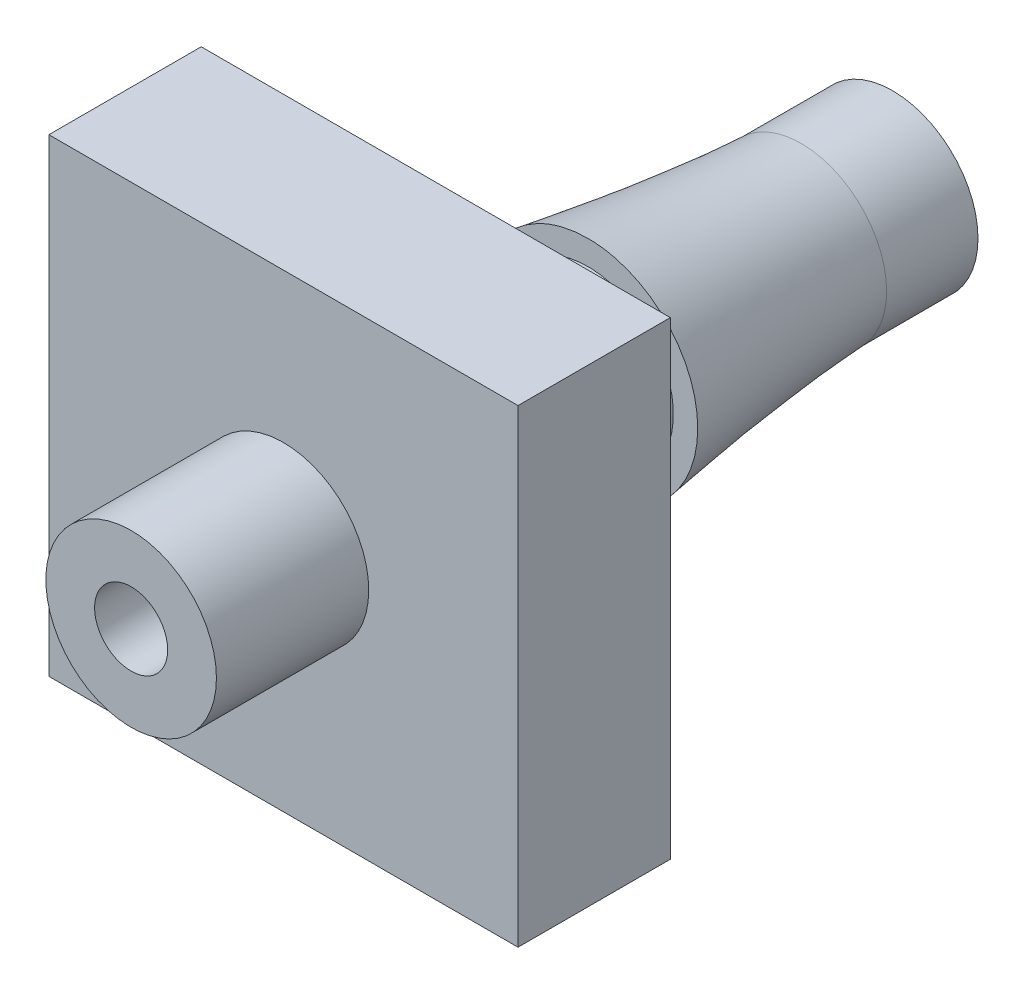
ISO-10303-21;
HEADER;
FILE_DESCRIPTION(('STEP AP214'),'2;1');
FILE_NAME('part.step','',(''),(''),'','','');
FILE_SCHEMA(('AUTOMOTIVE_DESIGN { 1 0 10303 214 1 1 1 1 }'));
ENDSEC;
DATA;
#1=APPLICATION_CONTEXT('core data for automotive mechanical design processes');
#2=APPLICATION_PROTOCOL_DEFINITION('international standard','automotive_design',2000,#1);
#3=PRODUCT_CONTEXT('',#1,'mechanical');
#4=PRODUCT('Part','Part','',(#3));
#5=PRODUCT_RELATED_PRODUCT_CATEGORY('part','',(#4));
#6=PRODUCT_DEFINITION_FORMATION('','',#4);
#7=PRODUCT_DEFINITION_CONTEXT('part definition',#1,'design');
#8=PRODUCT_DEFINITION('design','',#6,#7);
#9=PRODUCT_DEFINITION_SHAPE('','',#8);
#10=(LENGTH_UNIT() NAMED_UNIT(*) SI_UNIT(.MILLI.,.METRE.));
#11=(NAMED_UNIT(*) PLANE_ANGLE_UNIT() SI_UNIT($,.RADIAN.));
#12=(NAMED_UNIT(*) SI_UNIT($,.STERADIAN.) SOLID_ANGLE_UNIT());
#13=UNCERTAINTY_MEASURE_WITH_UNIT(LENGTH_MEASURE(1.E-05),#10,'distance_accuracy_value','');
#14=(GEOMETRIC_REPRESENTATION_CONTEXT(3) GLOBAL_UNCERTAINTY_ASSIGNED_CONTEXT((#13)) GLOBAL_UNIT_ASSIGNED_CONTEXT((#10,
#11,#12)) REPRESENTATION_CONTEXT('',''));
#15=CARTESIAN_POINT('',(0.,0.,0.));
#16=DIRECTION('',(0.,0.,1.));
#17=DIRECTION('',(1.,0.,0.));
#18=AXIS2_PLACEMENT_3D('',#15,#16,#17);
#19=CARTESIAN_POINT('',(0.,0.,-7.5));
#20=DIRECTION('',(0.,0.,1.));
#21=DIRECTION('',(1.,0.,0.));
#22=AXIS2_PLACEMENT_3D('',#19,#20,#21);
#23=CYLINDRICAL_SURFACE('',#22,1.4);
#24=CARTESIAN_POINT('',(0.,0.,0.));
#25=DIRECTION('',(0.,0.,-1.));
#26=DIRECTION('',(-1.,0.,0.));
#27=AXIS2_PLACEMENT_3D('',#24,#25,#26);
#28=CIRCLE('',#27,1.4);
#29=CARTESIAN_POINT('',(-1.4,0.,0.));
#30=VERTEX_POINT('',#29);
#31=EDGE_CURVE('E116',#30,#30,#28,.T.);
#32=ORIENTED_EDGE('',*,*,#31,.T.);
#33=EDGE_LOOP('',(#32));
#34=FACE_BOUND('',#33,.T.);
#35=CARTESIAN_POINT('',(0.,0.,-2.5));
#36=DIRECTION('',(0.,0.,-1.));
#37=DIRECTION('',(-1.,0.,0.));
#38=AXIS2_PLACEMENT_3D('',#35,#36,#37);
#39=CIRCLE('',#38,1.4);
#40=CARTESIAN_POINT('',(-1.4,0.,-2.5));
#41=VERTEX_POINT('',#40);
#42=EDGE_CURVE('E41',#41,#41,#39,.T.);
#43=ORIENTED_EDGE('',*,*,#42,.F.);
#44=EDGE_LOOP('',(#43));
#45=FACE_BOUND('',#44,.T.);
#46=ADVANCED_FACE('F37',(#34,#45),#23,.T.);
#47=CARTESIAN_POINT('',(3.85,-3.85,2.5));
#48=DIRECTION('',(-1.,0.,0.));
#49=DIRECTION('',(0.,-1.,0.));
#50=AXIS2_PLACEMENT_3D('',#47,#48,#49);
#51=PLANE('',#50);
#52=DIRECTION('',(0.,1.,0.));
#53=VECTOR('',#52,1.);
#54=CARTESIAN_POINT('',(3.85,-3.85,0.));
#55=LINE('',#54,#53);
#56=CARTESIAN_POINT('',(3.85,-3.85,0.));
#57=VERTEX_POINT('',#56);
#58=CARTESIAN_POINT('',(3.85,3.85,0.));
#59=VERTEX_POINT('',#58);
#60=EDGE_CURVE('E106',#57,#59,#55,.T.);
#61=ORIENTED_EDGE('',*,*,#60,.T.);
#62=DIRECTION('',(0.,0.,-1.));
#63=VECTOR('',#62,1.);
#64=CARTESIAN_POINT('',(3.85,3.85,2.5));
#65=LINE('',#64,#63);
#66=CARTESIAN_POINT('',(3.85,3.85,2.5));
#67=VERTEX_POINT('',#66);
#68=EDGE_CURVE('E97',#67,#59,#65,.T.);
#69=ORIENTED_EDGE('',*,*,#68,.F.);
#70=DIRECTION('',(0.,1.,0.));
#71=VECTOR('',#70,1.);
#72=CARTESIAN_POINT('',(3.85,-3.85,2.5));
#73=LINE('',#72,#71);
#74=CARTESIAN_POINT('',(3.85,-3.85,2.5));
#75=VERTEX_POINT('',#74);
#76=EDGE_CURVE('E91',#75,#67,#73,.T.);
#77=ORIENTED_EDGE('',*,*,#76,.F.);
#78=DIRECTION('',(0.,0.,-1.));
#79=VECTOR('',#78,1.);
#80=CARTESIAN_POINT('',(3.85,-3.85,2.5));
#81=LINE('',#80,#79);
#82=EDGE_CURVE('E102',#75,#57,#81,.T.);
#83=ORIENTED_EDGE('',*,*,#82,.T.);
#84=EDGE_LOOP('',(#61,#69,#77,#83));
#85=FACE_BOUND('',#84,.T.);
#86=ADVANCED_FACE('F39',(#85),#51,.F.);
#87=CARTESIAN_POINT('',(-3.85,3.85,2.5));
#88=DIRECTION('',(0.,-1.,0.));
#89=DIRECTION('',(0.,0.,-1.));
#90=AXIS2_PLACEMENT_3D('',#87,#88,#89);
#91=PLANE('',#90);
#92=DIRECTION('',(-1.,0.,0.));
#93=VECTOR('',#92,1.);
#94=CARTESIAN_POINT('',(-3.85,3.85,0.));
#95=LINE('',#94,#93);
#96=CARTESIAN_POINT('',(-3.85,3.85,0.));
#97=VERTEX_POINT('',#96);
#98=EDGE_CURVE('E96',#59,#97,#95,.T.);
#99=ORIENTED_EDGE('',*,*,#98,.T.);
#100=DIRECTION('',(0.,0.,-1.));
#101=VECTOR('',#100,1.);
#102=CARTESIAN_POINT('',(-3.85,3.85,2.5));
#103=LINE('',#102,#101);
#104=CARTESIAN_POINT('',(-3.85,3.85,2.5));
#105=VERTEX_POINT('',#104);
#106=EDGE_CURVE('E94',#105,#97,#103,.T.);
#107=ORIENTED_EDGE('',*,*,#106,.F.);
#108=DIRECTION('',(-1.,0.,0.));
#109=VECTOR('',#108,1.);
#110=CARTESIAN_POINT('',(-3.85,3.85,2.5));
#111=LINE('',#110,#109);
#112=EDGE_CURVE('E86',#67,#105,#111,.T.);
#113=ORIENTED_EDGE('',*,*,#112,.F.);
#114=ORIENTED_EDGE('',*,*,#68,.T.);
#115=EDGE_LOOP('',(#99,#107,#113,#114));
#116=FACE_BOUND('',#115,.T.);
#117=ADVANCED_FACE('F95',(#116),#91,.F.);
#118=CARTESIAN_POINT('',(-3.85,-3.85,2.5));
#119=DIRECTION('',(1.,0.,0.));
#120=DIRECTION('',(0.,0.,-1.));
#121=AXIS2_PLACEMENT_3D('',#118,#119,#120);
#122=PLANE('',#121);
#123=DIRECTION('',(0.,-1.,0.));
#124=VECTOR('',#123,1.);
#125=CARTESIAN_POINT('',(-3.85,-3.85,0.));
#126=LINE('',#125,#124);
#127=CARTESIAN_POINT('',(-3.85,-3.85,0.));
#128=VERTEX_POINT('',#127);
#129=EDGE_CURVE('E72',#97,#128,#126,.T.);
#130=ORIENTED_EDGE('',*,*,#129,.T.);
#131=DIRECTION('',(0.,0.,-1.));
#132=VECTOR('',#131,1.);
#133=CARTESIAN_POINT('',(-3.85,-3.85,2.5));
#134=LINE('',#133,#132);
#135=CARTESIAN_POINT('',(-3.85,-3.85,2.5));
#136=VERTEX_POINT('',#135);
#137=EDGE_CURVE('E98',#136,#128,#134,.T.);
#138=ORIENTED_EDGE('',*,*,#137,.F.);
#139=DIRECTION('',(0.,-1.,0.));
#140=VECTOR('',#139,1.);
#141=CARTESIAN_POINT('',(-3.85,-3.85,2.5));
#142=LINE('',#141,#140);
#143=EDGE_CURVE('E89',#105,#136,#142,.T.);
#144=ORIENTED_EDGE('',*,*,#143,.F.);
#145=ORIENTED_EDGE('',*,*,#106,.T.);
#146=EDGE_LOOP('',(#130,#138,#144,#145));
#147=FACE_BOUND('',#146,.T.);
#148=ADVANCED_FACE('F100',(#147),#122,.F.);
#149=CARTESIAN_POINT('',(-3.85,-3.85,2.5));
#150=DIRECTION('',(0.,1.,0.));
#151=DIRECTION('',(0.,0.,1.));
#152=AXIS2_PLACEMENT_3D('',#149,#150,#151);
#153=PLANE('',#152);
#154=DIRECTION('',(1.,0.,0.));
#155=VECTOR('',#154,1.);
#156=CARTESIAN_POINT('',(-3.85,-3.85,0.));
#157=LINE('',#156,#155);
#158=EDGE_CURVE('E78',#128,#57,#157,.T.);
#159=ORIENTED_EDGE('',*,*,#158,.T.);
#160=ORIENTED_EDGE('',*,*,#82,.F.);
#161=DIRECTION('',(1.,0.,0.));
#162=VECTOR('',#161,1.);
#163=CARTESIAN_POINT('',(-3.85,-3.85,2.5));
#164=LINE('',#163,#162);
#165=EDGE_CURVE('E55',#136,#75,#164,.T.);
#166=ORIENTED_EDGE('',*,*,#165,.F.);
#167=ORIENTED_EDGE('',*,*,#137,.T.);
#168=EDGE_LOOP('',(#159,#160,#166,#167));
#169=FACE_BOUND('',#168,.T.);
#170=ADVANCED_FACE('F140',(#169),#153,.F.);
#171=CARTESIAN_POINT('',(0.,0.,2.5));
#172=DIRECTION('',(0.,0.,-1.));
#173=DIRECTION('',(-1.,0.,0.));
#174=AXIS2_PLACEMENT_3D('',#171,#172,#173);
#175=PLANE('',#174);
#176=CARTESIAN_POINT('',(0.,0.,2.5));
#177=DIRECTION('',(0.,0.,1.));
#178=DIRECTION('',(1.,0.,0.));
#179=AXIS2_PLACEMENT_3D('',#176,#177,#178);
#180=CIRCLE('',#179,1.4);
#181=CARTESIAN_POINT('',(1.4,0.,2.5));
#182=VERTEX_POINT('',#181);
#183=EDGE_CURVE('E12',#182,#182,#180,.T.);
#184=ORIENTED_EDGE('',*,*,#183,.F.);
#185=EDGE_LOOP('',(#184));
#186=FACE_BOUND('',#185,.T.);
#187=ORIENTED_EDGE('',*,*,#76,.T.);
#188=ORIENTED_EDGE('',*,*,#112,.T.);
#189=ORIENTED_EDGE('',*,*,#143,.T.);
#190=ORIENTED_EDGE('',*,*,#165,.T.);
#191=EDGE_LOOP('',(#187,#188,#189,#190));
#192=FACE_BOUND('',#191,.T.);
#193=ADVANCED_FACE('F87',(#186,#192),#175,.F.);
#194=CARTESIAN_POINT('',(0.,0.,0.));
#195=DIRECTION('',(0.,0.,-1.));
#196=DIRECTION('',(-1.,0.,0.));
#197=AXIS2_PLACEMENT_3D('',#194,#195,#196);
#198=PLANE('',#197);
#199=ORIENTED_EDGE('',*,*,#31,.F.);
#200=EDGE_LOOP('',(#199));
#201=FACE_BOUND('',#200,.T.);
#202=ORIENTED_EDGE('',*,*,#60,.F.);
#203=ORIENTED_EDGE('',*,*,#158,.F.);
#204=ORIENTED_EDGE('',*,*,#129,.F.);
#205=ORIENTED_EDGE('',*,*,#98,.F.);
#206=EDGE_LOOP('',(#202,#203,#204,#205));
#207=FACE_BOUND('',#206,.T.);
#208=ADVANCED_FACE('F139',(#201,#207),#198,.T.);
#209=CARTESIAN_POINT('',(0.,0.,-2.5));
#210=DIRECTION('',(0.,0.,-1.));
#211=DIRECTION('',(-1.,0.,0.));
#212=AXIS2_PLACEMENT_3D('',#209,#210,#211);
#213=PLANE('',#212);
#214=ORIENTED_EDGE('',*,*,#42,.T.);
#215=EDGE_LOOP('',(#214));
#216=FACE_BOUND('',#215,.T.);
#217=CARTESIAN_POINT('',(0.,0.,-2.5));
#218=DIRECTION('',(0.,0.,-1.));
#219=DIRECTION('',(-1.,0.,0.));
#220=AXIS2_PLACEMENT_3D('',#217,#218,#219);
#221=CIRCLE('',#220,1.8);
#222=CARTESIAN_POINT('',(-1.8,0.,-2.5));
#223=VERTEX_POINT('',#222);
#224=EDGE_CURVE('E163',#223,#223,#221,.T.);
#225=ORIENTED_EDGE('',*,*,#224,.F.);
#226=EDGE_LOOP('',(#225));
#227=FACE_BOUND('',#226,.T.);
#228=ADVANCED_FACE('F144',(#216,#227),#213,.F.);
#229=CARTESIAN_POINT('',(-0.338397240311367,1.7679047790392,-2.5));
#230=CARTESIAN_POINT('',(-0.867767345215347,1.09862633983439,-6.));
#231=CARTESIAN_POINT('',(3.19741231776704,2.44469925966194,-2.5));
#232=CARTESIAN_POINT('',(1.32948533445343,2.83416103026508,-6.));
#233=CARTESIAN_POINT('',(3.87420679838977,-1.09111029841647,-2.5));
#234=CARTESIAN_POINT('',(3.06502002488413,0.636908350596305,-6.));
#235=CARTESIAN_POINT('',(0.338397240311367,-1.7679047790392,-2.5));
#236=CARTESIAN_POINT('',(0.867767345215347,-1.09862633983439,-6.));
#237=CARTESIAN_POINT('',(-3.19741231776704,-2.44469925966194,-2.5));
#238=CARTESIAN_POINT('',(-1.32948533445343,-2.83416103026508,-6.));
#239=CARTESIAN_POINT('',(-3.87420679838977,1.09111029841647,-2.5));
#240=CARTESIAN_POINT('',(-3.06502002488413,-0.636908350596304,-6.));
#241=CARTESIAN_POINT('',(-0.338397240311367,1.7679047790392,-2.5));
#242=CARTESIAN_POINT('',(-0.867767345215347,1.09862633983439,-6.));
#243=(BOUNDED_SURFACE() B_SPLINE_SURFACE(3,1,((#229,#230),(#231,#232),(#233,#234),(#235,#236),
(#237,#238),(#239,#240),(#241,#242)),.UNSPECIFIED.,.T.,.F.,.F.) B_SPLINE_SURFACE_WITH_KNOTS((4,
3,4),(2,2),(0.,0.5,1.),(0.,1.),
.UNSPECIFIED.) GEOMETRIC_REPRESENTATION_ITEM() RATIONAL_B_SPLINE_SURFACE(((1.,1.),
(0.333333333333333,0.333333333333333),(0.333333333333333,0.333333333333333),(1.,1.),
(0.333333333333333,0.333333333333333),(0.333333333333333,0.333333333333333),(1.,1.))) REPRESENTATION_ITEM('') SURFACE());
#244=CARTESIAN_POINT('',(-0.867767345215346,1.09862633983439,-5.99999999999999));
#245=CARTESIAN_POINT('',(-3.06502002488413,-0.6369083505963,-5.99999999999999));
#246=CARTESIAN_POINT('',(-1.32948533445344,-2.83416103026508,-5.99999999999999));
#247=CARTESIAN_POINT('',(0.867767345215346,-1.09862633983439,-5.99999999999999));
#248=CARTESIAN_POINT('',(3.06502002488413,0.6369083505963,-5.99999999999999));
#249=CARTESIAN_POINT('',(1.32948533445344,2.83416103026508,-5.99999999999999));
#250=CARTESIAN_POINT('',(-0.867767345215346,1.09862633983439,-5.99999999999999));
#251=(BOUNDED_CURVE() B_SPLINE_CURVE(3,(#244,#245,#246,#247,#248,#249,#250),.UNSPECIFIED.,.T.,
.F.) B_SPLINE_CURVE_WITH_KNOTS((4,3,4),(0.,0.5,1.),
.UNSPECIFIED.) CURVE() GEOMETRIC_REPRESENTATION_ITEM() RATIONAL_B_SPLINE_CURVE((1.,
0.333333333333333,0.333333333333333,1.,0.333333333333333,0.333333333333333,1.)) REPRESENTATION_ITEM(''));
#252=CARTESIAN_POINT('',(1.4,0.,-5.99999999999999));
#253=VERTEX_POINT('',#252);
#254=EDGE_CURVE('E120',#253,#253,#251,.T.);
#255=ORIENTED_EDGE('',*,*,#224,.T.);
#256=EDGE_LOOP('',(#255));
#257=FACE_BOUND('',#256,.T.);
#258=ORIENTED_EDGE('',*,*,#254,.T.);
#259=EDGE_LOOP('',(#258));
#260=FACE_BOUND('',#259,.T.);
#261=ADVANCED_FACE('F183',(#257,#260),#243,.T.);
#262=CARTESIAN_POINT('',(0.,0.,-7.5));
#263=DIRECTION('',(0.,0.,-1.));
#264=DIRECTION('',(-1.,0.,0.));
#265=AXIS2_PLACEMENT_3D('',#262,#263,#264);
#266=PLANE('',#265);
#267=CARTESIAN_POINT('',(0.,0.,-7.5));
#268=DIRECTION('',(0.,0.,-1.));
#269=DIRECTION('',(-1.,0.,0.));
#270=AXIS2_PLACEMENT_3D('',#267,#268,#269);
#271=CIRCLE('',#270,0.6);
#272=CARTESIAN_POINT('',(-0.6,0.,-7.5));
#273=VERTEX_POINT('',#272);
#274=EDGE_CURVE('E219',#273,#273,#271,.T.);
#275=ORIENTED_EDGE('',*,*,#274,.F.);
#276=EDGE_LOOP('',(#275));
#277=FACE_BOUND('',#276,.T.);
#278=CARTESIAN_POINT('',(0.,0.,-7.5));
#279=DIRECTION('',(0.,0.,-1.));
#280=DIRECTION('',(-1.,0.,0.));
#281=AXIS2_PLACEMENT_3D('',#278,#279,#280);
#282=CIRCLE('',#281,1.4);
#283=CARTESIAN_POINT('',(-1.4,0.,-7.5));
#284=VERTEX_POINT('',#283);
#285=EDGE_CURVE('E109',#284,#284,#282,.T.);
#286=ORIENTED_EDGE('',*,*,#285,.T.);
#287=EDGE_LOOP('',(#286));
#288=FACE_BOUND('',#287,.T.);
#289=ADVANCED_FACE('F135',(#277,#288),#266,.T.);
#290=ORIENTED_EDGE('',*,*,#285,.F.);
#291=EDGE_LOOP('',(#290));
#292=FACE_BOUND('',#291,.T.);
#293=ORIENTED_EDGE('',*,*,#254,.F.);
#294=EDGE_LOOP('',(#293));
#295=FACE_BOUND('',#294,.T.);
#296=ADVANCED_FACE('F134',(#292,#295),#23,.T.);
#297=CARTESIAN_POINT('',(0.,0.,5.));
#298=DIRECTION('',(0.,0.,-1.));
#299=DIRECTION('',(-1.,0.,0.));
#300=AXIS2_PLACEMENT_3D('',#297,#298,#299);
#301=CYLINDRICAL_SURFACE('',#300,1.4);
#302=CARTESIAN_POINT('',(0.,0.,5.));
#303=DIRECTION('',(0.,0.,1.));
#304=DIRECTION('',(1.,0.,0.));
#305=AXIS2_PLACEMENT_3D('',#302,#303,#304);
#306=CIRCLE('',#305,1.4);
#307=CARTESIAN_POINT('',(1.4,0.,5.));
#308=VERTEX_POINT('',#307);
#309=EDGE_CURVE('E168',#308,#308,#306,.T.);
#310=ORIENTED_EDGE('',*,*,#309,.F.);
#311=EDGE_LOOP('',(#310));
#312=FACE_BOUND('',#311,.T.);
#313=ORIENTED_EDGE('',*,*,#183,.T.);
#314=EDGE_LOOP('',(#313));
#315=FACE_BOUND('',#314,.T.);
#316=ADVANCED_FACE('F185',(#312,#315),#301,.T.);
#317=CARTESIAN_POINT('',(0.,0.,5.));
#318=DIRECTION('',(0.,0.,1.));
#319=DIRECTION('',(1.,0.,0.));
#320=AXIS2_PLACEMENT_3D('',#317,#318,#319);
#321=PLANE('',#320);
#322=CARTESIAN_POINT('',(0.,0.,5.));
#323=DIRECTION('',(0.,0.,-1.));
#324=DIRECTION('',(-1.,0.,0.));
#325=AXIS2_PLACEMENT_3D('',#322,#323,#324);
#326=CIRCLE('',#325,0.6);
#327=CARTESIAN_POINT('',(-0.6,0.,5.));
#328=VERTEX_POINT('',#327);
#329=EDGE_CURVE('E218',#328,#328,#326,.T.);
#330=ORIENTED_EDGE('',*,*,#329,.T.);
#331=EDGE_LOOP('',(#330));
#332=FACE_BOUND('',#331,.T.);
#333=ORIENTED_EDGE('',*,*,#309,.T.);
#334=EDGE_LOOP('',(#333));
#335=FACE_BOUND('',#334,.T.);
#336=ADVANCED_FACE('F225',(#332,#335),#321,.T.);
#337=CARTESIAN_POINT('',(0.,0.,5.));
#338=DIRECTION('',(0.,0.,-1.));
#339=DIRECTION('',(-1.,0.,0.));
#340=AXIS2_PLACEMENT_3D('',#337,#338,#339);
#341=CYLINDRICAL_SURFACE('',#340,0.6);
#342=ORIENTED_EDGE('',*,*,#329,.F.);
#343=EDGE_LOOP('',(#342));
#344=FACE_BOUND('',#343,.T.);
#345=ORIENTED_EDGE('',*,*,#274,.T.);
#346=EDGE_LOOP('',(#345));
#347=FACE_BOUND('',#346,.T.);
#348=ADVANCED_FACE('F228',(#344,#347),#341,.F.);
#349=CLOSED_SHELL('',(#46,#86,#117,#148,#170,#193,#208,#228,#261,#289,#296,#316,#336,#348));
#350=MANIFOLD_SOLID_BREP('B2',#349);
#351=ADVANCED_BREP_SHAPE_REPRESENTATION('',(#18,#350),#14);
#352=SHAPE_DEFINITION_REPRESENTATION(#9,#351);
ENDSEC;
END-ISO-10303-21;
